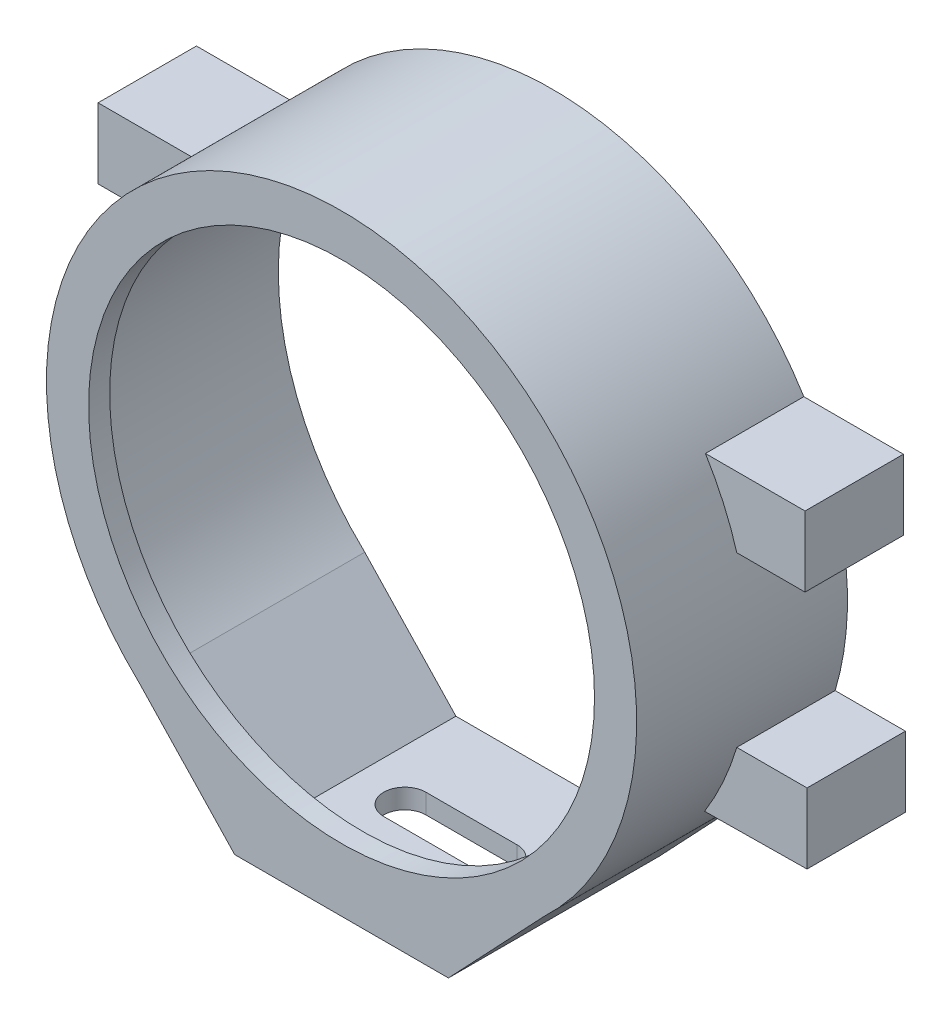
ISO-10303-21;
HEADER;
FILE_DESCRIPTION(('STEP AP214'),'2;1');
FILE_NAME('part.step','',(''),(''),'','','');
FILE_SCHEMA(('AUTOMOTIVE_DESIGN { 1 0 10303 214 1 1 1 1 }'));
ENDSEC;
DATA;
#1=APPLICATION_CONTEXT('core data for automotive mechanical design processes');
#2=APPLICATION_PROTOCOL_DEFINITION('international standard','automotive_design',2000,#1);
#3=PRODUCT_CONTEXT('',#1,'mechanical');
#4=PRODUCT('Part','Part','',(#3));
#5=PRODUCT_RELATED_PRODUCT_CATEGORY('part','',(#4));
#6=PRODUCT_DEFINITION_FORMATION('','',#4);
#7=PRODUCT_DEFINITION_CONTEXT('part definition',#1,'design');
#8=PRODUCT_DEFINITION('design','',#6,#7);
#9=PRODUCT_DEFINITION_SHAPE('','',#8);
#10=(LENGTH_UNIT() NAMED_UNIT(*) SI_UNIT(.MILLI.,.METRE.));
#11=(NAMED_UNIT(*) PLANE_ANGLE_UNIT() SI_UNIT($,.RADIAN.));
#12=(NAMED_UNIT(*) SI_UNIT($,.STERADIAN.) SOLID_ANGLE_UNIT());
#13=UNCERTAINTY_MEASURE_WITH_UNIT(LENGTH_MEASURE(1.E-05),#10,'distance_accuracy_value','');
#14=(GEOMETRIC_REPRESENTATION_CONTEXT(3) GLOBAL_UNCERTAINTY_ASSIGNED_CONTEXT((#13)) GLOBAL_UNIT_ASSIGNED_CONTEXT((#10,
#11,#12)) REPRESENTATION_CONTEXT('',''));
#15=CARTESIAN_POINT('',(0.,0.,0.));
#16=DIRECTION('',(0.,0.,1.));
#17=DIRECTION('',(1.,0.,0.));
#18=AXIS2_PLACEMENT_3D('',#15,#16,#17);
#19=CARTESIAN_POINT('',(7.60382752365368,-22.477243694566,15.));
#20=DIRECTION('',(-0.72676804131017,0.686882969748253,0.));
#21=DIRECTION('',(-0.686882969748253,-0.72676804131017,0.));
#22=AXIS2_PLACEMENT_3D('',#19,#20,#21);
#23=PLANE('',#22);
#24=DIRECTION('',(0.686882969748253,0.72676804131017,0.));
#25=VECTOR('',#24,1.);
#26=CARTESIAN_POINT('',(7.60382752365368,-22.477243694566,0.));
#27=LINE('',#26,#25);
#28=CARTESIAN_POINT('',(7.60382752365368,-22.477243694566,0.));
#29=VERTEX_POINT('',#28);
#30=CARTESIAN_POINT('',(14.4099892238069,-15.2758702066288,0.));
#31=VERTEX_POINT('',#30);
#32=EDGE_CURVE('E429',#29,#31,#27,.T.);
#33=ORIENTED_EDGE('',*,*,#32,.T.);
#34=DIRECTION('',(0.,0.,-1.));
#35=VECTOR('',#34,1.);
#36=CARTESIAN_POINT('',(14.4099892238069,-15.2758702066288,15.));
#37=LINE('',#36,#35);
#38=CARTESIAN_POINT('',(14.4099892238069,-15.2758702066288,15.));
#39=VERTEX_POINT('',#38);
#40=EDGE_CURVE('E511',#39,#31,#37,.T.);
#41=ORIENTED_EDGE('',*,*,#40,.F.);
#42=DIRECTION('',(0.686882969748253,0.72676804131017,0.));
#43=VECTOR('',#42,1.);
#44=CARTESIAN_POINT('',(7.60382752365368,-22.477243694566,15.));
#45=LINE('',#44,#43);
#46=CARTESIAN_POINT('',(7.60382752365368,-22.477243694566,15.));
#47=VERTEX_POINT('',#46);
#48=EDGE_CURVE('E469',#47,#39,#45,.T.);
#49=ORIENTED_EDGE('',*,*,#48,.F.);
#50=DIRECTION('',(0.,0.,-1.));
#51=VECTOR('',#50,1.);
#52=CARTESIAN_POINT('',(7.60382752365368,-22.477243694566,15.));
#53=LINE('',#52,#51);
#54=EDGE_CURVE('E483',#47,#29,#53,.T.);
#55=ORIENTED_EDGE('',*,*,#54,.T.);
#56=EDGE_LOOP('',(#33,#41,#49,#55));
#57=FACE_BOUND('',#56,.T.);
#58=ADVANCED_FACE('F47',(#57),#23,.F.);
#59=CARTESIAN_POINT('',(0.,0.,15.));
#60=DIRECTION('',(0.,0.,-1.));
#61=DIRECTION('',(-1.,0.,0.));
#62=AXIS2_PLACEMENT_3D('',#59,#60,#61);
#63=CYLINDRICAL_SURFACE('',#62,21.);
#64=CARTESIAN_POINT('',(0.,0.,7.));
#65=DIRECTION('',(0.,0.,1.));
#66=DIRECTION('',(1.,0.,0.));
#67=AXIS2_PLACEMENT_3D('',#64,#65,#66);
#68=CIRCLE('',#67,21.);
#69=CARTESIAN_POINT('',(20.1272262637342,5.99122382560092,7.));
#70=VERTEX_POINT('',#69);
#71=CARTESIAN_POINT('',(17.8939374877511,10.9912238256009,7.));
#72=VERTEX_POINT('',#71);
#73=EDGE_CURVE('E11',#70,#72,#68,.T.);
#74=ORIENTED_EDGE('',*,*,#73,.T.);
#75=DIRECTION('',(0.,0.,-1.));
#76=VECTOR('',#75,1.);
#77=CARTESIAN_POINT('',(17.8939374877511,10.9912238256009,15.));
#78=LINE('',#77,#76);
#79=CARTESIAN_POINT('',(17.8939374877511,10.9912238256009,0.));
#80=VERTEX_POINT('',#79);
#81=EDGE_CURVE('E311',#72,#80,#78,.T.);
#82=ORIENTED_EDGE('',*,*,#81,.T.);
#83=CARTESIAN_POINT('',(0.,0.,0.));
#84=DIRECTION('',(0.,0.,1.));
#85=DIRECTION('',(1.,0.,0.));
#86=AXIS2_PLACEMENT_3D('',#83,#84,#85);
#87=CIRCLE('',#86,21.);
#88=CARTESIAN_POINT('',(-17.893937487751,10.991223825601,0.));
#89=VERTEX_POINT('',#88);
#90=EDGE_CURVE('E494',#80,#89,#87,.T.);
#91=ORIENTED_EDGE('',*,*,#90,.T.);
#92=DIRECTION('',(0.,0.,-1.));
#93=VECTOR('',#92,1.);
#94=CARTESIAN_POINT('',(-17.893937487751,10.991223825601,15.));
#95=LINE('',#94,#93);
#96=CARTESIAN_POINT('',(-17.893937487751,10.991223825601,7.));
#97=VERTEX_POINT('',#96);
#98=EDGE_CURVE('E416',#89,#97,#95,.F.);
#99=ORIENTED_EDGE('',*,*,#98,.T.);
#100=CARTESIAN_POINT('',(0.,0.,7.));
#101=DIRECTION('',(0.,0.,1.));
#102=DIRECTION('',(1.,0.,0.));
#103=AXIS2_PLACEMENT_3D('',#100,#101,#102);
#104=CIRCLE('',#103,21.);
#105=CARTESIAN_POINT('',(-20.1272262637342,5.99122382560097,7.));
#106=VERTEX_POINT('',#105);
#107=EDGE_CURVE('E515',#97,#106,#104,.T.);
#108=ORIENTED_EDGE('',*,*,#107,.T.);
#109=DIRECTION('',(0.,0.,-1.));
#110=VECTOR('',#109,1.);
#111=CARTESIAN_POINT('',(-20.1272262637342,5.99122382560097,15.));
#112=LINE('',#111,#110);
#113=CARTESIAN_POINT('',(-20.1272262637342,5.99122382560097,0.));
#114=VERTEX_POINT('',#113);
#115=EDGE_CURVE('E409',#106,#114,#112,.T.);
#116=ORIENTED_EDGE('',*,*,#115,.T.);
#117=CARTESIAN_POINT('',(-20.1230758276449,-6.00514939321704,0.));
#118=VERTEX_POINT('',#117);
#119=EDGE_CURVE('E495',#114,#118,#87,.T.);
#120=ORIENTED_EDGE('',*,*,#119,.T.);
#121=DIRECTION('',(0.,0.,-1.));
#122=VECTOR('',#121,1.);
#123=CARTESIAN_POINT('',(-20.1230758276449,-6.00514939321704,15.));
#124=LINE('',#123,#122);
#125=CARTESIAN_POINT('',(-20.1230758276449,-6.00514939321704,7.));
#126=VERTEX_POINT('',#125);
#127=EDGE_CURVE('E376',#118,#126,#124,.F.);
#128=ORIENTED_EDGE('',*,*,#127,.T.);
#129=CARTESIAN_POINT('',(0.,0.,7.));
#130=DIRECTION('',(0.,0.,-1.));
#131=DIRECTION('',(-1.,0.,0.));
#132=AXIS2_PLACEMENT_3D('',#129,#130,#131);
#133=CIRCLE('',#132,21.);
#134=CARTESIAN_POINT('',(-17.8853763402668,-11.005149393217,7.));
#135=VERTEX_POINT('',#134);
#136=EDGE_CURVE('E522',#135,#126,#133,.T.);
#137=ORIENTED_EDGE('',*,*,#136,.F.);
#138=DIRECTION('',(0.,0.,-1.));
#139=VECTOR('',#138,1.);
#140=CARTESIAN_POINT('',(-17.8853763402668,-11.005149393217,15.));
#141=LINE('',#140,#139);
#142=CARTESIAN_POINT('',(-17.8853763402668,-11.005149393217,0.));
#143=VERTEX_POINT('',#142);
#144=EDGE_CURVE('E382',#135,#143,#141,.T.);
#145=ORIENTED_EDGE('',*,*,#144,.T.);
#146=CARTESIAN_POINT('',(-14.409989223807,-15.2758702066287,0.));
#147=VERTEX_POINT('',#146);
#148=EDGE_CURVE('E487',#143,#147,#87,.T.);
#149=ORIENTED_EDGE('',*,*,#148,.T.);
#150=DIRECTION('',(0.,0.,-1.));
#151=VECTOR('',#150,1.);
#152=CARTESIAN_POINT('',(-14.409989223807,-15.2758702066287,15.));
#153=LINE('',#152,#151);
#154=CARTESIAN_POINT('',(-14.409989223807,-15.2758702066287,15.));
#155=VERTEX_POINT('',#154);
#156=EDGE_CURVE('E507',#155,#147,#153,.T.);
#157=ORIENTED_EDGE('',*,*,#156,.F.);
#158=CARTESIAN_POINT('',(0.,0.,15.));
#159=DIRECTION('',(0.,0.,1.));
#160=DIRECTION('',(1.,0.,0.));
#161=AXIS2_PLACEMENT_3D('',#158,#159,#160);
#162=CIRCLE('',#161,21.);
#163=EDGE_CURVE('E473',#39,#155,#162,.T.);
#164=ORIENTED_EDGE('',*,*,#163,.F.);
#165=ORIENTED_EDGE('',*,*,#40,.T.);
#166=CARTESIAN_POINT('',(17.8338654555194,-11.0884283338277,0.));
#167=VERTEX_POINT('',#166);
#168=EDGE_CURVE('E488',#31,#167,#87,.T.);
#169=ORIENTED_EDGE('',*,*,#168,.T.);
#170=DIRECTION('',(0.,0.,-1.));
#171=VECTOR('',#170,1.);
#172=CARTESIAN_POINT('',(17.8338654555194,-11.0884283338277,15.));
#173=LINE('',#172,#171);
#174=CARTESIAN_POINT('',(17.8338654555194,-11.0884283338277,7.));
#175=VERTEX_POINT('',#174);
#176=EDGE_CURVE('E346',#167,#175,#173,.F.);
#177=ORIENTED_EDGE('',*,*,#176,.T.);
#178=CARTESIAN_POINT('',(0.,0.,7.));
#179=DIRECTION('',(0.,0.,1.));
#180=DIRECTION('',(1.,0.,0.));
#181=AXIS2_PLACEMENT_3D('',#178,#179,#180);
#182=CIRCLE('',#181,21.);
#183=CARTESIAN_POINT('',(20.1230758276449,-6.00514939321708,7.));
#184=VERTEX_POINT('',#183);
#185=EDGE_CURVE('E55',#175,#184,#182,.T.);
#186=ORIENTED_EDGE('',*,*,#185,.T.);
#187=DIRECTION('',(0.,0.,-1.));
#188=VECTOR('',#187,1.);
#189=CARTESIAN_POINT('',(20.1230758276449,-6.00514939321708,15.));
#190=LINE('',#189,#188);
#191=CARTESIAN_POINT('',(20.1230758276449,-6.00514939321708,0.));
#192=VERTEX_POINT('',#191);
#193=EDGE_CURVE('E339',#184,#192,#190,.T.);
#194=ORIENTED_EDGE('',*,*,#193,.T.);
#195=CARTESIAN_POINT('',(20.1272262637342,5.99122382560092,0.));
#196=VERTEX_POINT('',#195);
#197=EDGE_CURVE('E493',#192,#196,#87,.T.);
#198=ORIENTED_EDGE('',*,*,#197,.T.);
#199=DIRECTION('',(0.,0.,-1.));
#200=VECTOR('',#199,1.);
#201=CARTESIAN_POINT('',(20.1272262637342,5.99122382560092,15.));
#202=LINE('',#201,#200);
#203=EDGE_CURVE('E304',#196,#70,#202,.F.);
#204=ORIENTED_EDGE('',*,*,#203,.T.);
#205=EDGE_LOOP('',(#74,#82,#91,#99,#108,#116,#120,#128,#137,#145,#149,#157,#164,#165,#169,#177,
#186,#194,#198,#204));
#206=FACE_BOUND('',#205,.T.);
#207=ADVANCED_FACE('F528',(#206),#63,.T.);
#208=CARTESIAN_POINT('',(-7.60382752365368,-22.477243694566,15.));
#209=DIRECTION('',(0.72676804131017,0.686882969748253,0.));
#210=DIRECTION('',(-0.686882969748253,0.72676804131017,0.));
#211=AXIS2_PLACEMENT_3D('',#208,#209,#210);
#212=PLANE('',#211);
#213=DIRECTION('',(0.686882969748253,-0.72676804131017,0.));
#214=VECTOR('',#213,1.);
#215=CARTESIAN_POINT('',(-7.60382752365368,-22.477243694566,0.));
#216=LINE('',#215,#214);
#217=CARTESIAN_POINT('',(-7.60382752365368,-22.477243694566,0.));
#218=VERTEX_POINT('',#217);
#219=EDGE_CURVE('E492',#147,#218,#216,.T.);
#220=ORIENTED_EDGE('',*,*,#219,.T.);
#221=DIRECTION('',(0.,0.,-1.));
#222=VECTOR('',#221,1.);
#223=CARTESIAN_POINT('',(-7.60382752365368,-22.477243694566,15.));
#224=LINE('',#223,#222);
#225=CARTESIAN_POINT('',(-7.60382752365368,-22.477243694566,15.));
#226=VERTEX_POINT('',#225);
#227=EDGE_CURVE('E503',#226,#218,#224,.T.);
#228=ORIENTED_EDGE('',*,*,#227,.F.);
#229=DIRECTION('',(0.686882969748253,-0.72676804131017,0.));
#230=VECTOR('',#229,1.);
#231=CARTESIAN_POINT('',(-7.60382752365368,-22.477243694566,15.));
#232=LINE('',#231,#230);
#233=EDGE_CURVE('E477',#155,#226,#232,.T.);
#234=ORIENTED_EDGE('',*,*,#233,.F.);
#235=ORIENTED_EDGE('',*,*,#156,.T.);
#236=EDGE_LOOP('',(#220,#228,#234,#235));
#237=FACE_BOUND('',#236,.T.);
#238=ADVANCED_FACE('F595',(#237),#212,.F.);
#239=CARTESIAN_POINT('',(-7.60382752365368,-22.477243694566,15.));
#240=DIRECTION('',(0.,1.,0.));
#241=DIRECTION('',(0.,0.,1.));
#242=AXIS2_PLACEMENT_3D('',#239,#240,#241);
#243=PLANE('',#242);
#244=CARTESIAN_POINT('',(3.25082730165748,-22.477243694566,7.25));
#245=DIRECTION('',(0.,-1.,0.));
#246=DIRECTION('',(0.,0.,-1.));
#247=AXIS2_PLACEMENT_3D('',#244,#245,#246);
#248=CIRCLE('',#247,1.5);
#249=CARTESIAN_POINT('',(3.25082730165748,-22.477243694566,5.75));
#250=VERTEX_POINT('',#249);
#251=CARTESIAN_POINT('',(3.25082730165748,-22.477243694566,8.75));
#252=VERTEX_POINT('',#251);
#253=EDGE_CURVE('E248',#250,#252,#248,.T.);
#254=ORIENTED_EDGE('',*,*,#253,.F.);
#255=DIRECTION('',(1.,0.,0.));
#256=VECTOR('',#255,1.);
#257=CARTESIAN_POINT('',(-3.24917269834252,-22.477243694566,5.75));
#258=LINE('',#257,#256);
#259=CARTESIAN_POINT('',(-3.24917269834252,-22.477243694566,5.75));
#260=VERTEX_POINT('',#259);
#261=EDGE_CURVE('E264',#260,#250,#258,.T.);
#262=ORIENTED_EDGE('',*,*,#261,.F.);
#263=CARTESIAN_POINT('',(-3.24917269834252,-22.477243694566,7.25));
#264=DIRECTION('',(0.,-1.,0.));
#265=DIRECTION('',(0.,0.,-1.));
#266=AXIS2_PLACEMENT_3D('',#263,#264,#265);
#267=CIRCLE('',#266,1.5);
#268=CARTESIAN_POINT('',(-3.24917269834252,-22.477243694566,8.75));
#269=VERTEX_POINT('',#268);
#270=EDGE_CURVE('E261',#269,#260,#267,.T.);
#271=ORIENTED_EDGE('',*,*,#270,.F.);
#272=DIRECTION('',(1.,0.,0.));
#273=VECTOR('',#272,1.);
#274=CARTESIAN_POINT('',(-3.24917269834252,-22.477243694566,8.75));
#275=LINE('',#274,#273);
#276=EDGE_CURVE('E62',#269,#252,#275,.T.);
#277=ORIENTED_EDGE('',*,*,#276,.T.);
#278=EDGE_LOOP('',(#254,#262,#271,#277));
#279=FACE_BOUND('',#278,.T.);
#280=DIRECTION('',(1.,0.,0.));
#281=VECTOR('',#280,1.);
#282=CARTESIAN_POINT('',(-7.60382752365368,-22.477243694566,0.));
#283=LINE('',#282,#281);
#284=EDGE_CURVE('E474',#218,#29,#283,.T.);
#285=ORIENTED_EDGE('',*,*,#284,.T.);
#286=ORIENTED_EDGE('',*,*,#54,.F.);
#287=DIRECTION('',(1.,0.,0.));
#288=VECTOR('',#287,1.);
#289=CARTESIAN_POINT('',(-7.60382752365368,-22.477243694566,15.));
#290=LINE('',#289,#288);
#291=EDGE_CURVE('E480',#226,#47,#290,.T.);
#292=ORIENTED_EDGE('',*,*,#291,.F.);
#293=ORIENTED_EDGE('',*,*,#227,.T.);
#294=EDGE_LOOP('',(#285,#286,#292,#293));
#295=FACE_BOUND('',#294,.T.);
#296=ADVANCED_FACE('F608',(#279,#295),#243,.F.);
#297=CARTESIAN_POINT('',(0.,0.,15.));
#298=DIRECTION('',(0.,0.,1.));
#299=DIRECTION('',(1.,0.,0.));
#300=AXIS2_PLACEMENT_3D('',#297,#298,#299);
#301=PLANE('',#300);
#302=CARTESIAN_POINT('',(0.,0.,15.));
#303=DIRECTION('',(0.,0.,1.));
#304=DIRECTION('',(1.,0.,0.));
#305=AXIS2_PLACEMENT_3D('',#302,#303,#304);
#306=CIRCLE('',#305,18.);
#307=CARTESIAN_POINT('',(18.,0.,15.));
#308=VERTEX_POINT('',#307);
#309=EDGE_CURVE('E420',#308,#308,#306,.T.);
#310=ORIENTED_EDGE('',*,*,#309,.F.);
#311=EDGE_LOOP('',(#310));
#312=FACE_BOUND('',#311,.T.);
#313=ORIENTED_EDGE('',*,*,#48,.T.);
#314=ORIENTED_EDGE('',*,*,#163,.T.);
#315=ORIENTED_EDGE('',*,*,#233,.T.);
#316=ORIENTED_EDGE('',*,*,#291,.T.);
#317=EDGE_LOOP('',(#313,#314,#315,#316));
#318=FACE_BOUND('',#317,.T.);
#319=ADVANCED_FACE('F604',(#312,#318),#301,.T.);
#320=CARTESIAN_POINT('',(0.,0.,0.));
#321=DIRECTION('',(0.,0.,1.));
#322=DIRECTION('',(1.,0.,0.));
#323=AXIS2_PLACEMENT_3D('',#320,#321,#322);
#324=PLANE('',#323);
#325=ORIENTED_EDGE('',*,*,#90,.F.);
#326=DIRECTION('',(-1.,0.,0.));
#327=VECTOR('',#326,1.);
#328=CARTESIAN_POINT('',(17.5304640071432,10.9912238256009,0.));
#329=LINE('',#328,#327);
#330=CARTESIAN_POINT('',(24.9804640071432,10.9912238256009,0.));
#331=VERTEX_POINT('',#330);
#332=EDGE_CURVE('E289',#331,#80,#329,.T.);
#333=ORIENTED_EDGE('',*,*,#332,.F.);
#334=DIRECTION('',(0.,1.,0.));
#335=VECTOR('',#334,1.);
#336=CARTESIAN_POINT('',(24.9804640071432,10.9912238256009,0.));
#337=LINE('',#336,#335);
#338=CARTESIAN_POINT('',(24.9804640071432,5.99122382560092,0.));
#339=VERTEX_POINT('',#338);
#340=EDGE_CURVE('E284',#339,#331,#337,.T.);
#341=ORIENTED_EDGE('',*,*,#340,.F.);
#342=DIRECTION('',(1.,0.,0.));
#343=VECTOR('',#342,1.);
#344=CARTESIAN_POINT('',(19.9804640071432,5.99122382560092,0.));
#345=LINE('',#344,#343);
#346=EDGE_CURVE('E281',#196,#339,#345,.T.);
#347=ORIENTED_EDGE('',*,*,#346,.F.);
#348=ORIENTED_EDGE('',*,*,#197,.F.);
#349=DIRECTION('',(-1.,0.,0.));
#350=VECTOR('',#349,1.);
#351=CARTESIAN_POINT('',(20.0759852173844,-6.00514939321708,0.));
#352=LINE('',#351,#350);
#353=CARTESIAN_POINT('',(25.1230758276449,-6.00514939321708,0.));
#354=VERTEX_POINT('',#353);
#355=EDGE_CURVE('E324',#354,#192,#352,.T.);
#356=ORIENTED_EDGE('',*,*,#355,.F.);
#357=DIRECTION('',(0.,1.,0.));
#358=VECTOR('',#357,1.);
#359=CARTESIAN_POINT('',(25.1230758276449,-11.0051493932171,0.));
#360=LINE('',#359,#358);
#361=CARTESIAN_POINT('',(25.1230758276449,-11.0051493932171,0.));
#362=VERTEX_POINT('',#361);
#363=EDGE_CURVE('E319',#362,#354,#360,.T.);
#364=ORIENTED_EDGE('',*,*,#363,.F.);
#365=DIRECTION('',(0.999934741527293,0.0114242149290434,0.));
#366=VECTOR('',#365,1.);
#367=CARTESIAN_POINT('',(17.6735620032665,-11.0902597944385,0.));
#368=LINE('',#367,#366);
#369=EDGE_CURVE('E316',#167,#362,#368,.T.);
#370=ORIENTED_EDGE('',*,*,#369,.F.);
#371=ORIENTED_EDGE('',*,*,#168,.F.);
#372=ORIENTED_EDGE('',*,*,#32,.F.);
#373=ORIENTED_EDGE('',*,*,#284,.F.);
#374=ORIENTED_EDGE('',*,*,#219,.F.);
#375=ORIENTED_EDGE('',*,*,#148,.F.);
#376=DIRECTION('',(1.,0.,0.));
#377=VECTOR('',#376,1.);
#378=CARTESIAN_POINT('',(-17.8440815140315,-11.005149393217,0.));
#379=LINE('',#378,#377);
#380=CARTESIAN_POINT('',(-25.2940815140315,-11.005149393217,0.));
#381=VERTEX_POINT('',#380);
#382=EDGE_CURVE('E351',#381,#143,#379,.T.);
#383=ORIENTED_EDGE('',*,*,#382,.F.);
#384=DIRECTION('',(0.,-1.,0.));
#385=VECTOR('',#384,1.);
#386=CARTESIAN_POINT('',(-25.2940815140315,-11.005149393217,0.));
#387=LINE('',#386,#385);
#388=CARTESIAN_POINT('',(-25.2940815140315,-6.00514939321704,0.));
#389=VERTEX_POINT('',#388);
#390=EDGE_CURVE('E359',#389,#381,#387,.T.);
#391=ORIENTED_EDGE('',*,*,#390,.F.);
#392=DIRECTION('',(-1.,0.,0.));
#393=VECTOR('',#392,1.);
#394=CARTESIAN_POINT('',(-20.0940182972625,-6.00514939321704,0.));
#395=LINE('',#394,#393);
#396=EDGE_CURVE('E355',#118,#389,#395,.T.);
#397=ORIENTED_EDGE('',*,*,#396,.F.);
#398=ORIENTED_EDGE('',*,*,#119,.F.);
#399=DIRECTION('',(1.,0.,0.));
#400=VECTOR('',#399,1.);
#401=CARTESIAN_POINT('',(-20.0940182972625,5.99122382560097,0.));
#402=LINE('',#401,#400);
#403=CARTESIAN_POINT('',(-25.3273085086761,5.99122382560097,0.));
#404=VERTEX_POINT('',#403);
#405=EDGE_CURVE('E394',#404,#114,#402,.T.);
#406=ORIENTED_EDGE('',*,*,#405,.F.);
#407=DIRECTION('',(0.,-1.,0.));
#408=VECTOR('',#407,1.);
#409=CARTESIAN_POINT('',(-25.3273085086761,10.991223825601,0.));
#410=LINE('',#409,#408);
#411=CARTESIAN_POINT('',(-25.3273085086761,10.991223825601,0.));
#412=VERTEX_POINT('',#411);
#413=EDGE_CURVE('E389',#412,#404,#410,.T.);
#414=ORIENTED_EDGE('',*,*,#413,.F.);
#415=DIRECTION('',(-1.,0.,0.));
#416=VECTOR('',#415,1.);
#417=CARTESIAN_POINT('',(-17.8773085086761,10.991223825601,0.));
#418=LINE('',#417,#416);
#419=EDGE_CURVE('E386',#89,#412,#418,.T.);
#420=ORIENTED_EDGE('',*,*,#419,.F.);
#421=EDGE_LOOP('',(#325,#333,#341,#347,#348,#356,#364,#370,#371,#372,#373,#374,#375,#383,#391,
#397,#398,#406,#414,#420));
#422=FACE_BOUND('',#421,.T.);
#423=DIRECTION('',(1.,0.,0.));
#424=VECTOR('',#423,1.);
#425=CARTESIAN_POINT('',(-7.60382752365368,-21.077243694566,0.));
#426=LINE('',#425,#424);
#427=CARTESIAN_POINT('',(-6.86306319204945,-21.077243694566,0.));
#428=VERTEX_POINT('',#427);
#429=CARTESIAN_POINT('',(6.86306319204945,-21.077243694566,0.));
#430=VERTEX_POINT('',#429);
#431=EDGE_CURVE('E436',#428,#430,#426,.T.);
#432=ORIENTED_EDGE('',*,*,#431,.T.);
#433=DIRECTION('',(0.686882969748253,0.72676804131017,0.));
#434=VECTOR('',#433,1.);
#435=CARTESIAN_POINT('',(6.51367546168843,-21.4469192399436,0.));
#436=LINE('',#435,#434);
#437=CARTESIAN_POINT('',(13.3499464635317,-14.2136881005894,0.));
#438=VERTEX_POINT('',#437);
#439=EDGE_CURVE('E454',#430,#438,#436,.T.);
#440=ORIENTED_EDGE('',*,*,#439,.T.);
#441=CARTESIAN_POINT('',(0.,0.,0.));
#442=DIRECTION('',(0.,0.,1.));
#443=DIRECTION('',(1.,0.,0.));
#444=AXIS2_PLACEMENT_3D('',#441,#442,#443);
#445=CIRCLE('',#444,19.5);
#446=CARTESIAN_POINT('',(-13.3499464635318,-14.2136881005893,0.));
#447=VERTEX_POINT('',#446);
#448=EDGE_CURVE('E458',#438,#447,#445,.T.);
#449=ORIENTED_EDGE('',*,*,#448,.T.);
#450=DIRECTION('',(0.686882969748253,-0.72676804131017,0.));
#451=VECTOR('',#450,1.);
#452=CARTESIAN_POINT('',(-6.51367546168843,-21.4469192399436,0.));
#453=LINE('',#452,#451);
#454=EDGE_CURVE('E462',#447,#428,#453,.T.);
#455=ORIENTED_EDGE('',*,*,#454,.T.);
#456=EDGE_LOOP('',(#432,#440,#449,#455));
#457=FACE_BOUND('',#456,.T.);
#458=ADVANCED_FACE('F549',(#422,#457),#324,.F.);
#459=CARTESIAN_POINT('',(6.51367546168843,-21.4469192399436,15.));
#460=DIRECTION('',(-0.72676804131017,0.686882969748253,0.));
#461=DIRECTION('',(-0.686882969748253,-0.72676804131017,0.));
#462=AXIS2_PLACEMENT_3D('',#459,#460,#461);
#463=PLANE('',#462);
#464=ORIENTED_EDGE('',*,*,#439,.F.);
#465=DIRECTION('',(0.,0.,-1.));
#466=VECTOR('',#465,1.);
#467=CARTESIAN_POINT('',(6.86306319204945,-21.077243694566,15.));
#468=LINE('',#467,#466);
#469=CARTESIAN_POINT('',(6.86306319204945,-21.077243694566,13.5));
#470=VERTEX_POINT('',#469);
#471=EDGE_CURVE('E437',#470,#430,#468,.T.);
#472=ORIENTED_EDGE('',*,*,#471,.F.);
#473=DIRECTION('',(0.686882969748253,0.72676804131017,0.));
#474=VECTOR('',#473,1.);
#475=CARTESIAN_POINT('',(6.51367546168843,-21.4469192399436,13.5));
#476=LINE('',#475,#474);
#477=CARTESIAN_POINT('',(13.3499464635317,-14.2136881005894,13.5));
#478=VERTEX_POINT('',#477);
#479=EDGE_CURVE('E431',#470,#478,#476,.T.);
#480=ORIENTED_EDGE('',*,*,#479,.T.);
#481=DIRECTION('',(0.,0.,-1.));
#482=VECTOR('',#481,1.);
#483=CARTESIAN_POINT('',(13.3499464635317,-14.2136881005894,13.5));
#484=LINE('',#483,#482);
#485=EDGE_CURVE('E425',#478,#438,#484,.T.);
#486=ORIENTED_EDGE('',*,*,#485,.T.);
#487=EDGE_LOOP('',(#464,#472,#480,#486));
#488=FACE_BOUND('',#487,.T.);
#489=ADVANCED_FACE('F620',(#488),#463,.T.);
#490=CARTESIAN_POINT('',(0.,0.,15.));
#491=DIRECTION('',(0.,0.,-1.));
#492=DIRECTION('',(-1.,0.,0.));
#493=AXIS2_PLACEMENT_3D('',#490,#491,#492);
#494=CYLINDRICAL_SURFACE('',#493,19.5);
#495=ORIENTED_EDGE('',*,*,#448,.F.);
#496=ORIENTED_EDGE('',*,*,#485,.F.);
#497=CARTESIAN_POINT('',(0.,0.,13.5));
#498=DIRECTION('',(0.,0.,1.));
#499=DIRECTION('',(1.,0.,0.));
#500=AXIS2_PLACEMENT_3D('',#497,#498,#499);
#501=CIRCLE('',#500,19.5);
#502=CARTESIAN_POINT('',(-13.3499464635318,-14.2136881005893,13.5));
#503=VERTEX_POINT('',#502);
#504=EDGE_CURVE('E435',#478,#503,#501,.T.);
#505=ORIENTED_EDGE('',*,*,#504,.T.);
#506=DIRECTION('',(0.,0.,-1.));
#507=VECTOR('',#506,1.);
#508=CARTESIAN_POINT('',(-13.3499464635318,-14.2136881005893,13.5));
#509=LINE('',#508,#507);
#510=EDGE_CURVE('E430',#503,#447,#509,.T.);
#511=ORIENTED_EDGE('',*,*,#510,.T.);
#512=EDGE_LOOP('',(#495,#496,#505,#511));
#513=FACE_BOUND('',#512,.T.);
#514=ADVANCED_FACE('F634',(#513),#494,.F.);
#515=CARTESIAN_POINT('',(-6.51367546168843,-21.4469192399436,15.));
#516=DIRECTION('',(0.72676804131017,0.686882969748253,0.));
#517=DIRECTION('',(-0.686882969748253,0.72676804131017,0.));
#518=AXIS2_PLACEMENT_3D('',#515,#516,#517);
#519=PLANE('',#518);
#520=ORIENTED_EDGE('',*,*,#454,.F.);
#521=ORIENTED_EDGE('',*,*,#510,.F.);
#522=DIRECTION('',(0.686882969748253,-0.72676804131017,0.));
#523=VECTOR('',#522,1.);
#524=CARTESIAN_POINT('',(-6.51367546168843,-21.4469192399436,13.5));
#525=LINE('',#524,#523);
#526=CARTESIAN_POINT('',(-6.86306319204945,-21.077243694566,13.5));
#527=VERTEX_POINT('',#526);
#528=EDGE_CURVE('E447',#503,#527,#525,.T.);
#529=ORIENTED_EDGE('',*,*,#528,.T.);
#530=DIRECTION('',(0.,0.,-1.));
#531=VECTOR('',#530,1.);
#532=CARTESIAN_POINT('',(-6.86306319204945,-21.077243694566,15.));
#533=LINE('',#532,#531);
#534=EDGE_CURVE('E440',#527,#428,#533,.T.);
#535=ORIENTED_EDGE('',*,*,#534,.T.);
#536=EDGE_LOOP('',(#520,#521,#529,#535));
#537=FACE_BOUND('',#536,.T.);
#538=ADVANCED_FACE('F631',(#537),#519,.T.);
#539=CARTESIAN_POINT('',(-7.60382752365368,-21.077243694566,15.));
#540=DIRECTION('',(0.,1.,0.));
#541=DIRECTION('',(0.,0.,1.));
#542=AXIS2_PLACEMENT_3D('',#539,#540,#541);
#543=PLANE('',#542);
#544=DIRECTION('',(1.,0.,0.));
#545=VECTOR('',#544,1.);
#546=CARTESIAN_POINT('',(-3.24917269834252,-21.077243694566,5.75));
#547=LINE('',#546,#545);
#548=CARTESIAN_POINT('',(-3.24917269834252,-21.077243694566,5.75));
#549=VERTEX_POINT('',#548);
#550=CARTESIAN_POINT('',(3.25082730165748,-21.077243694566,5.75));
#551=VERTEX_POINT('',#550);
#552=EDGE_CURVE('E255',#549,#551,#547,.T.);
#553=ORIENTED_EDGE('',*,*,#552,.T.);
#554=CARTESIAN_POINT('',(3.25082730165748,-21.077243694566,7.25));
#555=DIRECTION('',(0.,1.,0.));
#556=DIRECTION('',(0.,0.,1.));
#557=AXIS2_PLACEMENT_3D('',#554,#555,#556);
#558=CIRCLE('',#557,1.5);
#559=CARTESIAN_POINT('',(3.25082730165748,-21.077243694566,8.75));
#560=VERTEX_POINT('',#559);
#561=EDGE_CURVE('E242',#551,#560,#558,.F.);
#562=ORIENTED_EDGE('',*,*,#561,.T.);
#563=DIRECTION('',(1.,0.,0.));
#564=VECTOR('',#563,1.);
#565=CARTESIAN_POINT('',(-3.24917269834252,-21.077243694566,8.75));
#566=LINE('',#565,#564);
#567=CARTESIAN_POINT('',(-3.24917269834252,-21.077243694566,8.75));
#568=VERTEX_POINT('',#567);
#569=EDGE_CURVE('E231',#568,#560,#566,.T.);
#570=ORIENTED_EDGE('',*,*,#569,.F.);
#571=CARTESIAN_POINT('',(-3.24917269834252,-21.077243694566,7.25));
#572=DIRECTION('',(0.,1.,0.));
#573=DIRECTION('',(0.,0.,1.));
#574=AXIS2_PLACEMENT_3D('',#571,#572,#573);
#575=CIRCLE('',#574,1.5);
#576=EDGE_CURVE('E241',#568,#549,#575,.F.);
#577=ORIENTED_EDGE('',*,*,#576,.T.);
#578=EDGE_LOOP('',(#553,#562,#570,#577));
#579=FACE_BOUND('',#578,.T.);
#580=ORIENTED_EDGE('',*,*,#431,.F.);
#581=ORIENTED_EDGE('',*,*,#534,.F.);
#582=DIRECTION('',(1.,0.,0.));
#583=VECTOR('',#582,1.);
#584=CARTESIAN_POINT('',(-7.60382752365368,-21.077243694566,13.5));
#585=LINE('',#584,#583);
#586=EDGE_CURVE('E441',#527,#470,#585,.T.);
#587=ORIENTED_EDGE('',*,*,#586,.T.);
#588=ORIENTED_EDGE('',*,*,#471,.T.);
#589=EDGE_LOOP('',(#580,#581,#587,#588));
#590=FACE_BOUND('',#589,.T.);
#591=ADVANCED_FACE('F253',(#579,#590),#543,.T.);
#592=CARTESIAN_POINT('',(0.,0.,13.5));
#593=DIRECTION('',(0.,0.,1.));
#594=DIRECTION('',(1.,0.,0.));
#595=AXIS2_PLACEMENT_3D('',#592,#593,#594);
#596=PLANE('',#595);
#597=CARTESIAN_POINT('',(0.,0.,13.5));
#598=DIRECTION('',(0.,0.,1.));
#599=DIRECTION('',(1.,0.,0.));
#600=AXIS2_PLACEMENT_3D('',#597,#598,#599);
#601=CIRCLE('',#600,18.);
#602=CARTESIAN_POINT('',(18.,0.,13.5));
#603=VERTEX_POINT('',#602);
#604=EDGE_CURVE('E424',#603,#603,#601,.T.);
#605=ORIENTED_EDGE('',*,*,#604,.T.);
#606=EDGE_LOOP('',(#605));
#607=FACE_BOUND('',#606,.T.);
#608=ORIENTED_EDGE('',*,*,#479,.F.);
#609=ORIENTED_EDGE('',*,*,#586,.F.);
#610=ORIENTED_EDGE('',*,*,#528,.F.);
#611=ORIENTED_EDGE('',*,*,#504,.F.);
#612=EDGE_LOOP('',(#608,#609,#610,#611));
#613=FACE_BOUND('',#612,.T.);
#614=ADVANCED_FACE('F624',(#607,#613),#596,.F.);
#615=CARTESIAN_POINT('',(0.,0.,4.));
#616=DIRECTION('',(0.,0.,1.));
#617=DIRECTION('',(1.,0.,0.));
#618=AXIS2_PLACEMENT_3D('',#615,#616,#617);
#619=CYLINDRICAL_SURFACE('',#618,18.);
#620=ORIENTED_EDGE('',*,*,#309,.T.);
#621=EDGE_LOOP('',(#620));
#622=FACE_BOUND('',#621,.T.);
#623=ORIENTED_EDGE('',*,*,#604,.F.);
#624=EDGE_LOOP('',(#623));
#625=FACE_BOUND('',#624,.T.);
#626=ADVANCED_FACE('F627',(#622,#625),#619,.F.);
#627=CARTESIAN_POINT('',(-17.8773085086761,10.991223825601,0.));
#628=DIRECTION('',(0.,1.,0.));
#629=DIRECTION('',(0.,0.,1.));
#630=AXIS2_PLACEMENT_3D('',#627,#628,#629);
#631=PLANE('',#630);
#632=ORIENTED_EDGE('',*,*,#98,.F.);
#633=ORIENTED_EDGE('',*,*,#419,.T.);
#634=DIRECTION('',(0.,0.,1.));
#635=VECTOR('',#634,1.);
#636=CARTESIAN_POINT('',(-25.3273085086761,10.991223825601,0.));
#637=LINE('',#636,#635);
#638=CARTESIAN_POINT('',(-25.3273085086761,10.991223825601,7.));
#639=VERTEX_POINT('',#638);
#640=EDGE_CURVE('E397',#412,#639,#637,.T.);
#641=ORIENTED_EDGE('',*,*,#640,.T.);
#642=DIRECTION('',(-1.,0.,0.));
#643=VECTOR('',#642,1.);
#644=CARTESIAN_POINT('',(-17.8773085086761,10.991223825601,7.));
#645=LINE('',#644,#643);
#646=EDGE_CURVE('E385',#97,#639,#645,.T.);
#647=ORIENTED_EDGE('',*,*,#646,.F.);
#648=EDGE_LOOP('',(#632,#633,#641,#647));
#649=FACE_BOUND('',#648,.T.);
#650=ADVANCED_FACE('F644',(#649),#631,.T.);
#651=CARTESIAN_POINT('',(-20.0940182972625,5.99122382560097,0.));
#652=DIRECTION('',(0.,-1.,0.));
#653=DIRECTION('',(0.,0.,-1.));
#654=AXIS2_PLACEMENT_3D('',#651,#652,#653);
#655=PLANE('',#654);
#656=ORIENTED_EDGE('',*,*,#115,.F.);
#657=DIRECTION('',(1.,0.,0.));
#658=VECTOR('',#657,1.);
#659=CARTESIAN_POINT('',(-20.0940182972625,5.99122382560097,7.));
#660=LINE('',#659,#658);
#661=CARTESIAN_POINT('',(-25.3273085086761,5.99122382560097,7.));
#662=VERTEX_POINT('',#661);
#663=EDGE_CURVE('E390',#662,#106,#660,.T.);
#664=ORIENTED_EDGE('',*,*,#663,.F.);
#665=DIRECTION('',(0.,0.,1.));
#666=VECTOR('',#665,1.);
#667=CARTESIAN_POINT('',(-25.3273085086761,5.99122382560097,0.));
#668=LINE('',#667,#666);
#669=EDGE_CURVE('E406',#404,#662,#668,.T.);
#670=ORIENTED_EDGE('',*,*,#669,.F.);
#671=ORIENTED_EDGE('',*,*,#405,.T.);
#672=EDGE_LOOP('',(#656,#664,#670,#671));
#673=FACE_BOUND('',#672,.T.);
#674=ADVANCED_FACE('F648',(#673),#655,.T.);
#675=CARTESIAN_POINT('',(-25.3273085086761,10.991223825601,0.));
#676=DIRECTION('',(-1.,0.,0.));
#677=DIRECTION('',(0.,0.,1.));
#678=AXIS2_PLACEMENT_3D('',#675,#676,#677);
#679=PLANE('',#678);
#680=DIRECTION('',(0.,-1.,0.));
#681=VECTOR('',#680,1.);
#682=CARTESIAN_POINT('',(-25.3273085086761,10.991223825601,7.));
#683=LINE('',#682,#681);
#684=EDGE_CURVE('E400',#639,#662,#683,.T.);
#685=ORIENTED_EDGE('',*,*,#684,.F.);
#686=ORIENTED_EDGE('',*,*,#640,.F.);
#687=ORIENTED_EDGE('',*,*,#413,.T.);
#688=ORIENTED_EDGE('',*,*,#669,.T.);
#689=EDGE_LOOP('',(#685,#686,#687,#688));
#690=FACE_BOUND('',#689,.T.);
#691=ADVANCED_FACE('F587',(#690),#679,.T.);
#692=CARTESIAN_POINT('',(0.,0.,7.));
#693=DIRECTION('',(0.,0.,1.));
#694=DIRECTION('',(1.,0.,0.));
#695=AXIS2_PLACEMENT_3D('',#692,#693,#694);
#696=PLANE('',#695);
#697=ORIENTED_EDGE('',*,*,#107,.F.);
#698=ORIENTED_EDGE('',*,*,#646,.T.);
#699=ORIENTED_EDGE('',*,*,#684,.T.);
#700=ORIENTED_EDGE('',*,*,#663,.T.);
#701=EDGE_LOOP('',(#697,#698,#699,#700));
#702=FACE_BOUND('',#701,.T.);
#703=ADVANCED_FACE('F580',(#702),#696,.T.);
#704=CARTESIAN_POINT('',(-17.8440815140315,-11.005149393217,0.));
#705=DIRECTION('',(0.,-1.,0.));
#706=DIRECTION('',(0.,0.,-1.));
#707=AXIS2_PLACEMENT_3D('',#704,#705,#706);
#708=PLANE('',#707);
#709=ORIENTED_EDGE('',*,*,#144,.F.);
#710=DIRECTION('',(1.,0.,0.));
#711=VECTOR('',#710,1.);
#712=CARTESIAN_POINT('',(-17.8440815140315,-11.005149393217,7.));
#713=LINE('',#712,#711);
#714=CARTESIAN_POINT('',(-25.2940815140315,-11.005149393217,7.));
#715=VERTEX_POINT('',#714);
#716=EDGE_CURVE('E350',#715,#135,#713,.T.);
#717=ORIENTED_EDGE('',*,*,#716,.F.);
#718=DIRECTION('',(0.,0.,1.));
#719=VECTOR('',#718,1.);
#720=CARTESIAN_POINT('',(-25.2940815140315,-11.005149393217,0.));
#721=LINE('',#720,#719);
#722=EDGE_CURVE('E373',#381,#715,#721,.T.);
#723=ORIENTED_EDGE('',*,*,#722,.F.);
#724=ORIENTED_EDGE('',*,*,#382,.T.);
#725=EDGE_LOOP('',(#709,#717,#723,#724));
#726=FACE_BOUND('',#725,.T.);
#727=ADVANCED_FACE('F578',(#726),#708,.T.);
#728=CARTESIAN_POINT('',(-20.0940182972625,-6.00514939321704,0.));
#729=DIRECTION('',(0.,1.,0.));
#730=DIRECTION('',(0.,0.,1.));
#731=AXIS2_PLACEMENT_3D('',#728,#729,#730);
#732=PLANE('',#731);
#733=ORIENTED_EDGE('',*,*,#127,.F.);
#734=ORIENTED_EDGE('',*,*,#396,.T.);
#735=DIRECTION('',(0.,0.,1.));
#736=VECTOR('',#735,1.);
#737=CARTESIAN_POINT('',(-25.2940815140315,-6.00514939321704,0.));
#738=LINE('',#737,#736);
#739=CARTESIAN_POINT('',(-25.2940815140315,-6.00514939321704,7.));
#740=VERTEX_POINT('',#739);
#741=EDGE_CURVE('E363',#389,#740,#738,.T.);
#742=ORIENTED_EDGE('',*,*,#741,.T.);
#743=DIRECTION('',(-1.,0.,0.));
#744=VECTOR('',#743,1.);
#745=CARTESIAN_POINT('',(-20.0940182972625,-6.00514939321704,7.));
#746=LINE('',#745,#744);
#747=EDGE_CURVE('E367',#126,#740,#746,.T.);
#748=ORIENTED_EDGE('',*,*,#747,.F.);
#749=EDGE_LOOP('',(#733,#734,#742,#748));
#750=FACE_BOUND('',#749,.T.);
#751=ADVANCED_FACE('F566',(#750),#732,.T.);
#752=CARTESIAN_POINT('',(-25.2940815140315,-11.005149393217,0.));
#753=DIRECTION('',(-1.,0.,0.));
#754=DIRECTION('',(0.,0.,1.));
#755=AXIS2_PLACEMENT_3D('',#752,#753,#754);
#756=PLANE('',#755);
#757=DIRECTION('',(0.,-1.,0.));
#758=VECTOR('',#757,1.);
#759=CARTESIAN_POINT('',(-25.2940815140315,-11.005149393217,7.));
#760=LINE('',#759,#758);
#761=EDGE_CURVE('E356',#740,#715,#760,.T.);
#762=ORIENTED_EDGE('',*,*,#761,.F.);
#763=ORIENTED_EDGE('',*,*,#741,.F.);
#764=ORIENTED_EDGE('',*,*,#390,.T.);
#765=ORIENTED_EDGE('',*,*,#722,.T.);
#766=EDGE_LOOP('',(#762,#763,#764,#765));
#767=FACE_BOUND('',#766,.T.);
#768=ADVANCED_FACE('F572',(#767),#756,.T.);
#769=CARTESIAN_POINT('',(0.,0.,7.));
#770=DIRECTION('',(0.,0.,-1.));
#771=DIRECTION('',(-1.,0.,0.));
#772=AXIS2_PLACEMENT_3D('',#769,#770,#771);
#773=PLANE('',#772);
#774=ORIENTED_EDGE('',*,*,#716,.T.);
#775=ORIENTED_EDGE('',*,*,#136,.T.);
#776=ORIENTED_EDGE('',*,*,#747,.T.);
#777=ORIENTED_EDGE('',*,*,#761,.T.);
#778=EDGE_LOOP('',(#774,#775,#776,#777));
#779=FACE_BOUND('',#778,.T.);
#780=ADVANCED_FACE('F575',(#779),#773,.F.);
#781=CARTESIAN_POINT('',(17.6735620032665,-11.0902597944385,0.));
#782=DIRECTION('',(0.0114242149290434,-0.999934741527293,0.));
#783=DIRECTION('',(0.999934741527293,0.0114242149290434,0.));
#784=AXIS2_PLACEMENT_3D('',#781,#782,#783);
#785=PLANE('',#784);
#786=ORIENTED_EDGE('',*,*,#176,.F.);
#787=ORIENTED_EDGE('',*,*,#369,.T.);
#788=DIRECTION('',(0.,0.,1.));
#789=VECTOR('',#788,1.);
#790=CARTESIAN_POINT('',(25.1230758276449,-11.0051493932171,0.));
#791=LINE('',#790,#789);
#792=CARTESIAN_POINT('',(25.1230758276449,-11.0051493932171,7.));
#793=VERTEX_POINT('',#792);
#794=EDGE_CURVE('E327',#362,#793,#791,.T.);
#795=ORIENTED_EDGE('',*,*,#794,.T.);
#796=DIRECTION('',(0.999934741527293,0.0114242149290434,0.));
#797=VECTOR('',#796,1.);
#798=CARTESIAN_POINT('',(17.6735620032665,-11.0902597944385,7.));
#799=LINE('',#798,#797);
#800=EDGE_CURVE('E315',#175,#793,#799,.T.);
#801=ORIENTED_EDGE('',*,*,#800,.F.);
#802=EDGE_LOOP('',(#786,#787,#795,#801));
#803=FACE_BOUND('',#802,.T.);
#804=ADVANCED_FACE('F537',(#803),#785,.T.);
#805=CARTESIAN_POINT('',(20.0759852173844,-6.00514939321708,0.));
#806=DIRECTION('',(0.,1.,0.));
#807=DIRECTION('',(0.,0.,1.));
#808=AXIS2_PLACEMENT_3D('',#805,#806,#807);
#809=PLANE('',#808);
#810=ORIENTED_EDGE('',*,*,#193,.F.);
#811=DIRECTION('',(-1.,0.,0.));
#812=VECTOR('',#811,1.);
#813=CARTESIAN_POINT('',(20.0759852173844,-6.00514939321708,7.));
#814=LINE('',#813,#812);
#815=CARTESIAN_POINT('',(25.1230758276449,-6.00514939321708,7.));
#816=VERTEX_POINT('',#815);
#817=EDGE_CURVE('E320',#816,#184,#814,.T.);
#818=ORIENTED_EDGE('',*,*,#817,.F.);
#819=DIRECTION('',(0.,0.,1.));
#820=VECTOR('',#819,1.);
#821=CARTESIAN_POINT('',(25.1230758276449,-6.00514939321708,0.));
#822=LINE('',#821,#820);
#823=EDGE_CURVE('E336',#354,#816,#822,.T.);
#824=ORIENTED_EDGE('',*,*,#823,.F.);
#825=ORIENTED_EDGE('',*,*,#355,.T.);
#826=EDGE_LOOP('',(#810,#818,#824,#825));
#827=FACE_BOUND('',#826,.T.);
#828=ADVANCED_FACE('F546',(#827),#809,.T.);
#829=CARTESIAN_POINT('',(25.1230758276449,-11.0051493932171,0.));
#830=DIRECTION('',(1.,0.,0.));
#831=DIRECTION('',(0.,0.,-1.));
#832=AXIS2_PLACEMENT_3D('',#829,#830,#831);
#833=PLANE('',#832);
#834=DIRECTION('',(0.,1.,0.));
#835=VECTOR('',#834,1.);
#836=CARTESIAN_POINT('',(25.1230758276449,-11.0051493932171,7.));
#837=LINE('',#836,#835);
#838=EDGE_CURVE('E330',#793,#816,#837,.T.);
#839=ORIENTED_EDGE('',*,*,#838,.F.);
#840=ORIENTED_EDGE('',*,*,#794,.F.);
#841=ORIENTED_EDGE('',*,*,#363,.T.);
#842=ORIENTED_EDGE('',*,*,#823,.T.);
#843=EDGE_LOOP('',(#839,#840,#841,#842));
#844=FACE_BOUND('',#843,.T.);
#845=ADVANCED_FACE('F543',(#844),#833,.T.);
#846=CARTESIAN_POINT('',(0.,0.,7.));
#847=DIRECTION('',(0.,0.,1.));
#848=DIRECTION('',(1.,0.,0.));
#849=AXIS2_PLACEMENT_3D('',#846,#847,#848);
#850=PLANE('',#849);
#851=ORIENTED_EDGE('',*,*,#185,.F.);
#852=ORIENTED_EDGE('',*,*,#800,.T.);
#853=ORIENTED_EDGE('',*,*,#838,.T.);
#854=ORIENTED_EDGE('',*,*,#817,.T.);
#855=EDGE_LOOP('',(#851,#852,#853,#854));
#856=FACE_BOUND('',#855,.T.);
#857=ADVANCED_FACE('F534',(#856),#850,.T.);
#858=CARTESIAN_POINT('',(17.5304640071432,10.9912238256009,0.));
#859=DIRECTION('',(0.,1.,0.));
#860=DIRECTION('',(-1.,0.,0.));
#861=AXIS2_PLACEMENT_3D('',#858,#859,#860);
#862=PLANE('',#861);
#863=ORIENTED_EDGE('',*,*,#81,.F.);
#864=DIRECTION('',(-1.,0.,0.));
#865=VECTOR('',#864,1.);
#866=CARTESIAN_POINT('',(17.5304640071432,10.9912238256009,7.));
#867=LINE('',#866,#865);
#868=CARTESIAN_POINT('',(24.9804640071432,10.9912238256009,7.));
#869=VERTEX_POINT('',#868);
#870=EDGE_CURVE('E285',#869,#72,#867,.T.);
#871=ORIENTED_EDGE('',*,*,#870,.F.);
#872=DIRECTION('',(0.,0.,1.));
#873=VECTOR('',#872,1.);
#874=CARTESIAN_POINT('',(24.9804640071432,10.9912238256009,0.));
#875=LINE('',#874,#873);
#876=EDGE_CURVE('E301',#331,#869,#875,.T.);
#877=ORIENTED_EDGE('',*,*,#876,.F.);
#878=ORIENTED_EDGE('',*,*,#332,.T.);
#879=EDGE_LOOP('',(#863,#871,#877,#878));
#880=FACE_BOUND('',#879,.T.);
#881=ADVANCED_FACE('F668',(#880),#862,.T.);
#882=CARTESIAN_POINT('',(19.9804640071432,5.99122382560092,0.));
#883=DIRECTION('',(0.,-1.,0.));
#884=DIRECTION('',(0.,0.,-1.));
#885=AXIS2_PLACEMENT_3D('',#882,#883,#884);
#886=PLANE('',#885);
#887=ORIENTED_EDGE('',*,*,#203,.F.);
#888=ORIENTED_EDGE('',*,*,#346,.T.);
#889=DIRECTION('',(0.,0.,1.));
#890=VECTOR('',#889,1.);
#891=CARTESIAN_POINT('',(24.9804640071432,5.99122382560092,0.));
#892=LINE('',#891,#890);
#893=CARTESIAN_POINT('',(24.9804640071432,5.99122382560092,7.));
#894=VERTEX_POINT('',#893);
#895=EDGE_CURVE('E292',#339,#894,#892,.T.);
#896=ORIENTED_EDGE('',*,*,#895,.T.);
#897=DIRECTION('',(1.,0.,0.));
#898=VECTOR('',#897,1.);
#899=CARTESIAN_POINT('',(19.9804640071432,5.99122382560092,7.));
#900=LINE('',#899,#898);
#901=EDGE_CURVE('E280',#70,#894,#900,.T.);
#902=ORIENTED_EDGE('',*,*,#901,.F.);
#903=EDGE_LOOP('',(#887,#888,#896,#902));
#904=FACE_BOUND('',#903,.T.);
#905=ADVANCED_FACE('F675',(#904),#886,.T.);
#906=CARTESIAN_POINT('',(24.9804640071432,10.9912238256009,0.));
#907=DIRECTION('',(1.,0.,0.));
#908=DIRECTION('',(0.,1.,0.));
#909=AXIS2_PLACEMENT_3D('',#906,#907,#908);
#910=PLANE('',#909);
#911=DIRECTION('',(0.,1.,0.));
#912=VECTOR('',#911,1.);
#913=CARTESIAN_POINT('',(24.9804640071432,10.9912238256009,7.));
#914=LINE('',#913,#912);
#915=EDGE_CURVE('E295',#894,#869,#914,.T.);
#916=ORIENTED_EDGE('',*,*,#915,.F.);
#917=ORIENTED_EDGE('',*,*,#895,.F.);
#918=ORIENTED_EDGE('',*,*,#340,.T.);
#919=ORIENTED_EDGE('',*,*,#876,.T.);
#920=EDGE_LOOP('',(#916,#917,#918,#919));
#921=FACE_BOUND('',#920,.T.);
#922=ADVANCED_FACE('F672',(#921),#910,.T.);
#923=CARTESIAN_POINT('',(0.,0.,7.));
#924=DIRECTION('',(0.,0.,1.));
#925=DIRECTION('',(1.,0.,0.));
#926=AXIS2_PLACEMENT_3D('',#923,#924,#925);
#927=PLANE('',#926);
#928=ORIENTED_EDGE('',*,*,#73,.F.);
#929=ORIENTED_EDGE('',*,*,#901,.T.);
#930=ORIENTED_EDGE('',*,*,#915,.T.);
#931=ORIENTED_EDGE('',*,*,#870,.T.);
#932=EDGE_LOOP('',(#928,#929,#930,#931));
#933=FACE_BOUND('',#932,.T.);
#934=ADVANCED_FACE('F677',(#933),#927,.T.);
#935=CARTESIAN_POINT('',(-3.24917269834252,21.001,5.75));
#936=DIRECTION('',(0.,0.,-1.));
#937=DIRECTION('',(-1.,0.,0.));
#938=AXIS2_PLACEMENT_3D('',#935,#936,#937);
#939=PLANE('',#938);
#940=DIRECTION('',(0.,-1.,0.));
#941=VECTOR('',#940,1.);
#942=CARTESIAN_POINT('',(-3.24917269834252,21.001,5.75));
#943=LINE('',#942,#941);
#944=EDGE_CURVE('E70',#549,#260,#943,.T.);
#945=ORIENTED_EDGE('',*,*,#944,.T.);
#946=ORIENTED_EDGE('',*,*,#261,.T.);
#947=DIRECTION('',(0.,-1.,0.));
#948=VECTOR('',#947,1.);
#949=CARTESIAN_POINT('',(3.25082730165748,21.001,5.75));
#950=LINE('',#949,#948);
#951=EDGE_CURVE('E250',#551,#250,#950,.T.);
#952=ORIENTED_EDGE('',*,*,#951,.F.);
#953=ORIENTED_EDGE('',*,*,#552,.F.);
#954=EDGE_LOOP('',(#945,#946,#952,#953));
#955=FACE_BOUND('',#954,.T.);
#956=ADVANCED_FACE('F679',(#955),#939,.F.);
#957=CARTESIAN_POINT('',(3.25082730165748,21.001,7.25));
#958=DIRECTION('',(0.,-1.,0.));
#959=DIRECTION('',(0.,0.,-1.));
#960=AXIS2_PLACEMENT_3D('',#957,#958,#959);
#961=CYLINDRICAL_SURFACE('',#960,1.5);
#962=ORIENTED_EDGE('',*,*,#951,.T.);
#963=ORIENTED_EDGE('',*,*,#253,.T.);
#964=DIRECTION('',(0.,-1.,0.));
#965=VECTOR('',#964,1.);
#966=CARTESIAN_POINT('',(3.25082730165748,21.001,8.75));
#967=LINE('',#966,#965);
#968=EDGE_CURVE('E234',#560,#252,#967,.T.);
#969=ORIENTED_EDGE('',*,*,#968,.F.);
#970=ORIENTED_EDGE('',*,*,#561,.F.);
#971=EDGE_LOOP('',(#962,#963,#969,#970));
#972=FACE_BOUND('',#971,.T.);
#973=ADVANCED_FACE('F245',(#972),#961,.F.);
#974=CARTESIAN_POINT('',(-3.24917269834252,21.001,8.75));
#975=DIRECTION('',(0.,0.,-1.));
#976=DIRECTION('',(-1.,0.,0.));
#977=AXIS2_PLACEMENT_3D('',#974,#975,#976);
#978=PLANE('',#977);
#979=ORIENTED_EDGE('',*,*,#569,.T.);
#980=ORIENTED_EDGE('',*,*,#968,.T.);
#981=ORIENTED_EDGE('',*,*,#276,.F.);
#982=DIRECTION('',(0.,-1.,0.));
#983=VECTOR('',#982,1.);
#984=CARTESIAN_POINT('',(-3.24917269834252,21.001,8.75));
#985=LINE('',#984,#983);
#986=EDGE_CURVE('E236',#568,#269,#985,.T.);
#987=ORIENTED_EDGE('',*,*,#986,.F.);
#988=EDGE_LOOP('',(#979,#980,#981,#987));
#989=FACE_BOUND('',#988,.T.);
#990=ADVANCED_FACE('F233',(#989),#978,.T.);
#991=CARTESIAN_POINT('',(-3.24917269834252,21.001,7.25));
#992=DIRECTION('',(0.,-1.,0.));
#993=DIRECTION('',(0.,0.,-1.));
#994=AXIS2_PLACEMENT_3D('',#991,#992,#993);
#995=CYLINDRICAL_SURFACE('',#994,1.5);
#996=ORIENTED_EDGE('',*,*,#986,.T.);
#997=ORIENTED_EDGE('',*,*,#270,.T.);
#998=ORIENTED_EDGE('',*,*,#944,.F.);
#999=ORIENTED_EDGE('',*,*,#576,.F.);
#1000=EDGE_LOOP('',(#996,#997,#998,#999));
#1001=FACE_BOUND('',#1000,.T.);
#1002=ADVANCED_FACE('F690',(#1001),#995,.F.);
#1003=CLOSED_SHELL('',(#58,#207,#238,#296,#319,#458,#489,#514,#538,#591,#614,#626,#650,#674,
#691,#703,#727,#751,#768,#780,#804,#828,#845,#857,#881,#905,#922,#934,#956,#973,#990,#1002));
#1004=MANIFOLD_SOLID_BREP('B2',#1003);
#1005=ADVANCED_BREP_SHAPE_REPRESENTATION('',(#18,#1004),#14);
#1006=SHAPE_DEFINITION_REPRESENTATION(#9,#1005);
ENDSEC;
END-ISO-10303-21;
